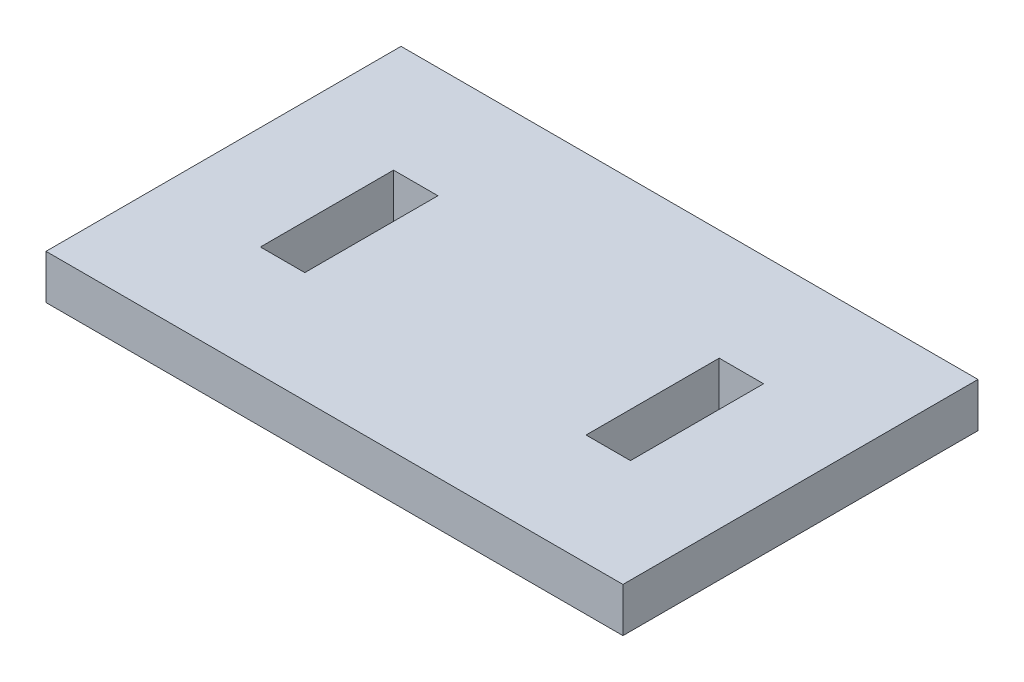
ISO-10303-21;
HEADER;
FILE_DESCRIPTION(('STEP AP214'),'2;1');
FILE_NAME('part.step','',(''),(''),'','','');
FILE_SCHEMA(('AUTOMOTIVE_DESIGN { 1 0 10303 214 1 1 1 1 }'));
ENDSEC;
DATA;
#1=APPLICATION_CONTEXT('core data for automotive mechanical design processes');
#2=APPLICATION_PROTOCOL_DEFINITION('international standard','automotive_design',2000,#1);
#3=PRODUCT_CONTEXT('',#1,'mechanical');
#4=PRODUCT('Part','Part','',(#3));
#5=PRODUCT_RELATED_PRODUCT_CATEGORY('part','',(#4));
#6=PRODUCT_DEFINITION_FORMATION('','',#4);
#7=PRODUCT_DEFINITION_CONTEXT('part definition',#1,'design');
#8=PRODUCT_DEFINITION('design','',#6,#7);
#9=PRODUCT_DEFINITION_SHAPE('','',#8);
#10=(LENGTH_UNIT() NAMED_UNIT(*) SI_UNIT(.MILLI.,.METRE.));
#11=(NAMED_UNIT(*) PLANE_ANGLE_UNIT() SI_UNIT($,.RADIAN.));
#12=(NAMED_UNIT(*) SI_UNIT($,.STERADIAN.) SOLID_ANGLE_UNIT());
#13=UNCERTAINTY_MEASURE_WITH_UNIT(LENGTH_MEASURE(1.E-05),#10,'distance_accuracy_value','');
#14=(GEOMETRIC_REPRESENTATION_CONTEXT(3) GLOBAL_UNCERTAINTY_ASSIGNED_CONTEXT((#13)) GLOBAL_UNIT_ASSIGNED_CONTEXT((#10,
#11,#12)) REPRESENTATION_CONTEXT('',''));
#15=CARTESIAN_POINT('',(0.,0.,0.));
#16=DIRECTION('',(0.,0.,1.));
#17=DIRECTION('',(1.,0.,0.));
#18=AXIS2_PLACEMENT_3D('',#15,#16,#17);
#19=CARTESIAN_POINT('',(0.,3.175,0.));
#20=DIRECTION('',(0.,-1.,0.));
#21=DIRECTION('',(0.,0.,-1.));
#22=AXIS2_PLACEMENT_3D('',#19,#20,#21);
#23=PLANE('',#22);
#24=DIRECTION('',(0.,0.,1.));
#25=VECTOR('',#24,1.);
#26=CARTESIAN_POINT('',(7.40130587110055,3.175,-17.4625));
#27=LINE('',#26,#25);
#28=CARTESIAN_POINT('',(7.40130587110055,3.175,-17.4625));
#29=VERTEX_POINT('',#28);
#30=CARTESIAN_POINT('',(7.40130587110056,3.175,-7.9375));
#31=VERTEX_POINT('',#30);
#32=EDGE_CURVE('E158',#29,#31,#27,.T.);
#33=ORIENTED_EDGE('',*,*,#32,.F.);
#34=DIRECTION('',(-1.,0.,0.));
#35=VECTOR('',#34,1.);
#36=CARTESIAN_POINT('',(7.40130587110055,3.175,-17.4625));
#37=LINE('',#36,#35);
#38=CARTESIAN_POINT('',(10.5763058711006,3.175,-17.4625));
#39=VERTEX_POINT('',#38);
#40=EDGE_CURVE('E166',#39,#29,#37,.T.);
#41=ORIENTED_EDGE('',*,*,#40,.F.);
#42=DIRECTION('',(0.,0.,-1.));
#43=VECTOR('',#42,1.);
#44=CARTESIAN_POINT('',(10.5763058711006,3.175,-17.4625));
#45=LINE('',#44,#43);
#46=CARTESIAN_POINT('',(10.5763058711006,3.175,-7.9375));
#47=VERTEX_POINT('',#46);
#48=EDGE_CURVE('E163',#47,#39,#45,.T.);
#49=ORIENTED_EDGE('',*,*,#48,.F.);
#50=DIRECTION('',(1.,0.,0.));
#51=VECTOR('',#50,1.);
#52=CARTESIAN_POINT('',(7.40130587110056,3.175,-7.9375));
#53=LINE('',#52,#51);
#54=EDGE_CURVE('E160',#31,#47,#53,.T.);
#55=ORIENTED_EDGE('',*,*,#54,.F.);
#56=EDGE_LOOP('',(#33,#41,#49,#55));
#57=FACE_BOUND('',#56,.T.);
#58=DIRECTION('',(0.,0.,1.));
#59=VECTOR('',#58,1.);
#60=CARTESIAN_POINT('',(0.,3.175,0.));
#61=LINE('',#60,#59);
#62=CARTESIAN_POINT('',(0.,3.175,-25.4));
#63=VERTEX_POINT('',#62);
#64=CARTESIAN_POINT('',(0.,3.175,0.));
#65=VERTEX_POINT('',#64);
#66=EDGE_CURVE('E189',#63,#65,#61,.T.);
#67=ORIENTED_EDGE('',*,*,#66,.T.);
#68=DIRECTION('',(1.,0.,0.));
#69=VECTOR('',#68,1.);
#70=CARTESIAN_POINT('',(0.,3.175,0.));
#71=LINE('',#70,#69);
#72=CARTESIAN_POINT('',(41.275,3.175,0.));
#73=VERTEX_POINT('',#72);
#74=EDGE_CURVE('E192',#65,#73,#71,.T.);
#75=ORIENTED_EDGE('',*,*,#74,.T.);
#76=DIRECTION('',(0.,0.,-1.));
#77=VECTOR('',#76,1.);
#78=CARTESIAN_POINT('',(41.275,3.175,0.));
#79=LINE('',#78,#77);
#80=CARTESIAN_POINT('',(41.275,3.175,-25.4));
#81=VERTEX_POINT('',#80);
#82=EDGE_CURVE('E195',#73,#81,#79,.T.);
#83=ORIENTED_EDGE('',*,*,#82,.T.);
#84=DIRECTION('',(-1.,0.,0.));
#85=VECTOR('',#84,1.);
#86=CARTESIAN_POINT('',(0.,3.175,-25.4));
#87=LINE('',#86,#85);
#88=EDGE_CURVE('E197',#81,#63,#87,.T.);
#89=ORIENTED_EDGE('',*,*,#88,.T.);
#90=EDGE_LOOP('',(#67,#75,#83,#89));
#91=FACE_BOUND('',#90,.T.);
#92=DIRECTION('',(0.,0.,-1.));
#93=VECTOR('',#92,1.);
#94=CARTESIAN_POINT('',(33.8736941288994,3.175,-17.4625));
#95=LINE('',#94,#93);
#96=CARTESIAN_POINT('',(33.8736941288994,3.175,-7.9375));
#97=VERTEX_POINT('',#96);
#98=CARTESIAN_POINT('',(33.8736941288994,3.175,-17.4625));
#99=VERTEX_POINT('',#98);
#100=EDGE_CURVE('E122',#97,#99,#95,.T.);
#101=ORIENTED_EDGE('',*,*,#100,.F.);
#102=DIRECTION('',(1.,0.,0.));
#103=VECTOR('',#102,1.);
#104=CARTESIAN_POINT('',(33.8736941288994,3.175,-7.9375));
#105=LINE('',#104,#103);
#106=CARTESIAN_POINT('',(30.6986941288994,3.175,-7.9375));
#107=VERTEX_POINT('',#106);
#108=EDGE_CURVE('E144',#107,#97,#105,.T.);
#109=ORIENTED_EDGE('',*,*,#108,.F.);
#110=DIRECTION('',(0.,0.,1.));
#111=VECTOR('',#110,1.);
#112=CARTESIAN_POINT('',(30.6986941288994,3.175,-17.4625));
#113=LINE('',#112,#111);
#114=CARTESIAN_POINT('',(30.6986941288994,3.175,-17.4625));
#115=VERTEX_POINT('',#114);
#116=EDGE_CURVE('E142',#115,#107,#113,.T.);
#117=ORIENTED_EDGE('',*,*,#116,.F.);
#118=DIRECTION('',(-1.,0.,0.));
#119=VECTOR('',#118,1.);
#120=CARTESIAN_POINT('',(33.8736941288994,3.175,-17.4625));
#121=LINE('',#120,#119);
#122=EDGE_CURVE('E130',#99,#115,#121,.T.);
#123=ORIENTED_EDGE('',*,*,#122,.F.);
#124=EDGE_LOOP('',(#101,#109,#117,#123));
#125=FACE_BOUND('',#124,.T.);
#126=ADVANCED_FACE('F33',(#57,#91,#125),#23,.F.);
#127=CARTESIAN_POINT('',(0.,0.,0.));
#128=DIRECTION('',(0.,-1.,0.));
#129=DIRECTION('',(0.,0.,-1.));
#130=AXIS2_PLACEMENT_3D('',#127,#128,#129);
#131=PLANE('',#130);
#132=DIRECTION('',(0.,0.,1.));
#133=VECTOR('',#132,1.);
#134=CARTESIAN_POINT('',(0.,0.,0.));
#135=LINE('',#134,#133);
#136=CARTESIAN_POINT('',(0.,0.,-25.4));
#137=VERTEX_POINT('',#136);
#138=CARTESIAN_POINT('',(0.,0.,0.));
#139=VERTEX_POINT('',#138);
#140=EDGE_CURVE('E188',#137,#139,#135,.T.);
#141=ORIENTED_EDGE('',*,*,#140,.F.);
#142=DIRECTION('',(-1.,0.,0.));
#143=VECTOR('',#142,1.);
#144=CARTESIAN_POINT('',(0.,0.,-25.4));
#145=LINE('',#144,#143);
#146=CARTESIAN_POINT('',(41.275,0.,-25.4));
#147=VERTEX_POINT('',#146);
#148=EDGE_CURVE('E193',#147,#137,#145,.T.);
#149=ORIENTED_EDGE('',*,*,#148,.F.);
#150=DIRECTION('',(0.,0.,-1.));
#151=VECTOR('',#150,1.);
#152=CARTESIAN_POINT('',(41.275,0.,0.));
#153=LINE('',#152,#151);
#154=CARTESIAN_POINT('',(41.275,0.,0.));
#155=VERTEX_POINT('',#154);
#156=EDGE_CURVE('E204',#155,#147,#153,.T.);
#157=ORIENTED_EDGE('',*,*,#156,.F.);
#158=DIRECTION('',(1.,0.,0.));
#159=VECTOR('',#158,1.);
#160=CARTESIAN_POINT('',(0.,0.,0.));
#161=LINE('',#160,#159);
#162=EDGE_CURVE('E202',#139,#155,#161,.T.);
#163=ORIENTED_EDGE('',*,*,#162,.F.);
#164=EDGE_LOOP('',(#141,#149,#157,#163));
#165=FACE_BOUND('',#164,.T.);
#166=DIRECTION('',(-1.,0.,0.));
#167=VECTOR('',#166,1.);
#168=CARTESIAN_POINT('',(7.40130587110055,0.,-17.4625));
#169=LINE('',#168,#167);
#170=CARTESIAN_POINT('',(10.5763058711006,0.,-17.4625));
#171=VERTEX_POINT('',#170);
#172=CARTESIAN_POINT('',(7.40130587110055,0.,-17.4625));
#173=VERTEX_POINT('',#172);
#174=EDGE_CURVE('E161',#171,#173,#169,.T.);
#175=ORIENTED_EDGE('',*,*,#174,.T.);
#176=DIRECTION('',(0.,0.,1.));
#177=VECTOR('',#176,1.);
#178=CARTESIAN_POINT('',(7.40130587110055,0.,-17.4625));
#179=LINE('',#178,#177);
#180=CARTESIAN_POINT('',(7.40130587110056,0.,-7.9375));
#181=VERTEX_POINT('',#180);
#182=EDGE_CURVE('E138',#173,#181,#179,.T.);
#183=ORIENTED_EDGE('',*,*,#182,.T.);
#184=DIRECTION('',(1.,0.,0.));
#185=VECTOR('',#184,1.);
#186=CARTESIAN_POINT('',(7.40130587110056,0.,-7.9375));
#187=LINE('',#186,#185);
#188=CARTESIAN_POINT('',(10.5763058711006,0.,-7.9375));
#189=VERTEX_POINT('',#188);
#190=EDGE_CURVE('E171',#181,#189,#187,.T.);
#191=ORIENTED_EDGE('',*,*,#190,.T.);
#192=DIRECTION('',(0.,0.,-1.));
#193=VECTOR('',#192,1.);
#194=CARTESIAN_POINT('',(10.5763058711006,0.,-17.4625));
#195=LINE('',#194,#193);
#196=EDGE_CURVE('E174',#189,#171,#195,.T.);
#197=ORIENTED_EDGE('',*,*,#196,.T.);
#198=EDGE_LOOP('',(#175,#183,#191,#197));
#199=FACE_BOUND('',#198,.T.);
#200=DIRECTION('',(1.,0.,0.));
#201=VECTOR('',#200,1.);
#202=CARTESIAN_POINT('',(33.8736941288994,0.,-7.9375));
#203=LINE('',#202,#201);
#204=CARTESIAN_POINT('',(30.6986941288994,0.,-7.9375));
#205=VERTEX_POINT('',#204);
#206=CARTESIAN_POINT('',(33.8736941288994,0.,-7.9375));
#207=VERTEX_POINT('',#206);
#208=EDGE_CURVE('E131',#205,#207,#203,.T.);
#209=ORIENTED_EDGE('',*,*,#208,.T.);
#210=DIRECTION('',(0.,0.,-1.));
#211=VECTOR('',#210,1.);
#212=CARTESIAN_POINT('',(33.8736941288994,0.,-17.4625));
#213=LINE('',#212,#211);
#214=CARTESIAN_POINT('',(33.8736941288994,0.,-17.4625));
#215=VERTEX_POINT('',#214);
#216=EDGE_CURVE('E56',#207,#215,#213,.T.);
#217=ORIENTED_EDGE('',*,*,#216,.T.);
#218=DIRECTION('',(-1.,0.,0.));
#219=VECTOR('',#218,1.);
#220=CARTESIAN_POINT('',(33.8736941288994,0.,-17.4625));
#221=LINE('',#220,#219);
#222=CARTESIAN_POINT('',(30.6986941288994,0.,-17.4625));
#223=VERTEX_POINT('',#222);
#224=EDGE_CURVE('E137',#215,#223,#221,.T.);
#225=ORIENTED_EDGE('',*,*,#224,.T.);
#226=DIRECTION('',(0.,0.,1.));
#227=VECTOR('',#226,1.);
#228=CARTESIAN_POINT('',(30.6986941288994,0.,-17.4625));
#229=LINE('',#228,#227);
#230=EDGE_CURVE('E150',#223,#205,#229,.T.);
#231=ORIENTED_EDGE('',*,*,#230,.T.);
#232=EDGE_LOOP('',(#209,#217,#225,#231));
#233=FACE_BOUND('',#232,.T.);
#234=ADVANCED_FACE('F222',(#165,#199,#233),#131,.T.);
#235=CARTESIAN_POINT('',(0.,3.175,0.));
#236=DIRECTION('',(1.,0.,0.));
#237=DIRECTION('',(0.,0.,-1.));
#238=AXIS2_PLACEMENT_3D('',#235,#236,#237);
#239=PLANE('',#238);
#240=ORIENTED_EDGE('',*,*,#140,.T.);
#241=DIRECTION('',(0.,-1.,0.));
#242=VECTOR('',#241,1.);
#243=CARTESIAN_POINT('',(0.,3.175,0.));
#244=LINE('',#243,#242);
#245=EDGE_CURVE('E11',#65,#139,#244,.T.);
#246=ORIENTED_EDGE('',*,*,#245,.F.);
#247=ORIENTED_EDGE('',*,*,#66,.F.);
#248=DIRECTION('',(0.,-1.,0.));
#249=VECTOR('',#248,1.);
#250=CARTESIAN_POINT('',(0.,3.175,-25.4));
#251=LINE('',#250,#249);
#252=EDGE_CURVE('E199',#63,#137,#251,.T.);
#253=ORIENTED_EDGE('',*,*,#252,.T.);
#254=EDGE_LOOP('',(#240,#246,#247,#253));
#255=FACE_BOUND('',#254,.T.);
#256=ADVANCED_FACE('F35',(#255),#239,.F.);
#257=CARTESIAN_POINT('',(0.,3.175,0.));
#258=DIRECTION('',(0.,0.,-1.));
#259=DIRECTION('',(-1.,0.,0.));
#260=AXIS2_PLACEMENT_3D('',#257,#258,#259);
#261=PLANE('',#260);
#262=ORIENTED_EDGE('',*,*,#162,.T.);
#263=DIRECTION('',(0.,-1.,0.));
#264=VECTOR('',#263,1.);
#265=CARTESIAN_POINT('',(41.275,3.175,0.));
#266=LINE('',#265,#264);
#267=EDGE_CURVE('E41',#73,#155,#266,.T.);
#268=ORIENTED_EDGE('',*,*,#267,.F.);
#269=ORIENTED_EDGE('',*,*,#74,.F.);
#270=ORIENTED_EDGE('',*,*,#245,.T.);
#271=EDGE_LOOP('',(#262,#268,#269,#270));
#272=FACE_BOUND('',#271,.T.);
#273=ADVANCED_FACE('F232',(#272),#261,.F.);
#274=CARTESIAN_POINT('',(41.275,3.175,0.));
#275=DIRECTION('',(-1.,0.,0.));
#276=DIRECTION('',(0.,0.,1.));
#277=AXIS2_PLACEMENT_3D('',#274,#275,#276);
#278=PLANE('',#277);
#279=ORIENTED_EDGE('',*,*,#156,.T.);
#280=DIRECTION('',(0.,-1.,0.));
#281=VECTOR('',#280,1.);
#282=CARTESIAN_POINT('',(41.275,3.175,-25.4));
#283=LINE('',#282,#281);
#284=EDGE_CURVE('E209',#81,#147,#283,.T.);
#285=ORIENTED_EDGE('',*,*,#284,.F.);
#286=ORIENTED_EDGE('',*,*,#82,.F.);
#287=ORIENTED_EDGE('',*,*,#267,.T.);
#288=EDGE_LOOP('',(#279,#285,#286,#287));
#289=FACE_BOUND('',#288,.T.);
#290=ADVANCED_FACE('F216',(#289),#278,.F.);
#291=CARTESIAN_POINT('',(0.,3.175,-25.4));
#292=DIRECTION('',(0.,0.,1.));
#293=DIRECTION('',(1.,0.,0.));
#294=AXIS2_PLACEMENT_3D('',#291,#292,#293);
#295=PLANE('',#294);
#296=ORIENTED_EDGE('',*,*,#148,.T.);
#297=ORIENTED_EDGE('',*,*,#252,.F.);
#298=ORIENTED_EDGE('',*,*,#88,.F.);
#299=ORIENTED_EDGE('',*,*,#284,.T.);
#300=EDGE_LOOP('',(#296,#297,#298,#299));
#301=FACE_BOUND('',#300,.T.);
#302=ADVANCED_FACE('F226',(#301),#295,.F.);
#303=CARTESIAN_POINT('',(7.40130587110055,3.175,-17.4625));
#304=DIRECTION('',(1.,0.,0.));
#305=DIRECTION('',(0.,0.,-1.));
#306=AXIS2_PLACEMENT_3D('',#303,#304,#305);
#307=PLANE('',#306);
#308=ORIENTED_EDGE('',*,*,#182,.F.);
#309=DIRECTION('',(0.,-1.,0.));
#310=VECTOR('',#309,1.);
#311=CARTESIAN_POINT('',(7.40130587110055,3.175,-17.4625));
#312=LINE('',#311,#310);
#313=EDGE_CURVE('E168',#29,#173,#312,.T.);
#314=ORIENTED_EDGE('',*,*,#313,.F.);
#315=ORIENTED_EDGE('',*,*,#32,.T.);
#316=DIRECTION('',(0.,-1.,0.));
#317=VECTOR('',#316,1.);
#318=CARTESIAN_POINT('',(7.40130587110056,3.175,-7.9375));
#319=LINE('',#318,#317);
#320=EDGE_CURVE('E185',#31,#181,#319,.T.);
#321=ORIENTED_EDGE('',*,*,#320,.T.);
#322=EDGE_LOOP('',(#308,#314,#315,#321));
#323=FACE_BOUND('',#322,.T.);
#324=ADVANCED_FACE('F248',(#323),#307,.T.);
#325=CARTESIAN_POINT('',(7.40130587110056,3.175,-7.9375));
#326=DIRECTION('',(0.,0.,-1.));
#327=DIRECTION('',(-1.,0.,0.));
#328=AXIS2_PLACEMENT_3D('',#325,#326,#327);
#329=PLANE('',#328);
#330=ORIENTED_EDGE('',*,*,#190,.F.);
#331=ORIENTED_EDGE('',*,*,#320,.F.);
#332=ORIENTED_EDGE('',*,*,#54,.T.);
#333=DIRECTION('',(0.,-1.,0.));
#334=VECTOR('',#333,1.);
#335=CARTESIAN_POINT('',(10.5763058711006,3.175,-7.9375));
#336=LINE('',#335,#334);
#337=EDGE_CURVE('E183',#47,#189,#336,.T.);
#338=ORIENTED_EDGE('',*,*,#337,.T.);
#339=EDGE_LOOP('',(#330,#331,#332,#338));
#340=FACE_BOUND('',#339,.T.);
#341=ADVANCED_FACE('F255',(#340),#329,.T.);
#342=CARTESIAN_POINT('',(10.5763058711006,3.175,-17.4625));
#343=DIRECTION('',(-1.,0.,0.));
#344=DIRECTION('',(0.,0.,1.));
#345=AXIS2_PLACEMENT_3D('',#342,#343,#344);
#346=PLANE('',#345);
#347=ORIENTED_EDGE('',*,*,#196,.F.);
#348=ORIENTED_EDGE('',*,*,#337,.F.);
#349=ORIENTED_EDGE('',*,*,#48,.T.);
#350=DIRECTION('',(0.,-1.,0.));
#351=VECTOR('',#350,1.);
#352=CARTESIAN_POINT('',(10.5763058711006,3.175,-17.4625));
#353=LINE('',#352,#351);
#354=EDGE_CURVE('E181',#39,#171,#353,.T.);
#355=ORIENTED_EDGE('',*,*,#354,.T.);
#356=EDGE_LOOP('',(#347,#348,#349,#355));
#357=FACE_BOUND('',#356,.T.);
#358=ADVANCED_FACE('F260',(#357),#346,.T.);
#359=CARTESIAN_POINT('',(7.40130587110055,3.175,-17.4625));
#360=DIRECTION('',(0.,0.,1.));
#361=DIRECTION('',(1.,0.,0.));
#362=AXIS2_PLACEMENT_3D('',#359,#360,#361);
#363=PLANE('',#362);
#364=ORIENTED_EDGE('',*,*,#174,.F.);
#365=ORIENTED_EDGE('',*,*,#354,.F.);
#366=ORIENTED_EDGE('',*,*,#40,.T.);
#367=ORIENTED_EDGE('',*,*,#313,.T.);
#368=EDGE_LOOP('',(#364,#365,#366,#367));
#369=FACE_BOUND('',#368,.T.);
#370=ADVANCED_FACE('F266',(#369),#363,.T.);
#371=CARTESIAN_POINT('',(33.8736941288994,3.175,-17.4625));
#372=DIRECTION('',(-1.,0.,0.));
#373=DIRECTION('',(0.,0.,1.));
#374=AXIS2_PLACEMENT_3D('',#371,#372,#373);
#375=PLANE('',#374);
#376=ORIENTED_EDGE('',*,*,#216,.F.);
#377=DIRECTION('',(0.,-1.,0.));
#378=VECTOR('',#377,1.);
#379=CARTESIAN_POINT('',(33.8736941288994,3.175,-7.9375));
#380=LINE('',#379,#378);
#381=EDGE_CURVE('E126',#97,#207,#380,.T.);
#382=ORIENTED_EDGE('',*,*,#381,.F.);
#383=ORIENTED_EDGE('',*,*,#100,.T.);
#384=DIRECTION('',(0.,-1.,0.));
#385=VECTOR('',#384,1.);
#386=CARTESIAN_POINT('',(33.8736941288994,3.175,-17.4625));
#387=LINE('',#386,#385);
#388=EDGE_CURVE('E125',#99,#215,#387,.T.);
#389=ORIENTED_EDGE('',*,*,#388,.T.);
#390=EDGE_LOOP('',(#376,#382,#383,#389));
#391=FACE_BOUND('',#390,.T.);
#392=ADVANCED_FACE('F124',(#391),#375,.T.);
#393=CARTESIAN_POINT('',(33.8736941288994,3.175,-17.4625));
#394=DIRECTION('',(0.,0.,1.));
#395=DIRECTION('',(1.,0.,0.));
#396=AXIS2_PLACEMENT_3D('',#393,#394,#395);
#397=PLANE('',#396);
#398=ORIENTED_EDGE('',*,*,#224,.F.);
#399=ORIENTED_EDGE('',*,*,#388,.F.);
#400=ORIENTED_EDGE('',*,*,#122,.T.);
#401=DIRECTION('',(0.,-1.,0.));
#402=VECTOR('',#401,1.);
#403=CARTESIAN_POINT('',(30.6986941288994,3.175,-17.4625));
#404=LINE('',#403,#402);
#405=EDGE_CURVE('E139',#115,#223,#404,.T.);
#406=ORIENTED_EDGE('',*,*,#405,.T.);
#407=EDGE_LOOP('',(#398,#399,#400,#406));
#408=FACE_BOUND('',#407,.T.);
#409=ADVANCED_FACE('F134',(#408),#397,.T.);
#410=CARTESIAN_POINT('',(30.6986941288994,3.175,-17.4625));
#411=DIRECTION('',(1.,0.,0.));
#412=DIRECTION('',(0.,0.,-1.));
#413=AXIS2_PLACEMENT_3D('',#410,#411,#412);
#414=PLANE('',#413);
#415=ORIENTED_EDGE('',*,*,#230,.F.);
#416=ORIENTED_EDGE('',*,*,#405,.F.);
#417=ORIENTED_EDGE('',*,*,#116,.T.);
#418=DIRECTION('',(0.,-1.,0.));
#419=VECTOR('',#418,1.);
#420=CARTESIAN_POINT('',(30.6986941288994,3.175,-7.9375));
#421=LINE('',#420,#419);
#422=EDGE_CURVE('E48',#107,#205,#421,.T.);
#423=ORIENTED_EDGE('',*,*,#422,.T.);
#424=EDGE_LOOP('',(#415,#416,#417,#423));
#425=FACE_BOUND('',#424,.T.);
#426=ADVANCED_FACE('F285',(#425),#414,.T.);
#427=CARTESIAN_POINT('',(33.8736941288994,3.175,-7.9375));
#428=DIRECTION('',(0.,0.,-1.));
#429=DIRECTION('',(-1.,0.,0.));
#430=AXIS2_PLACEMENT_3D('',#427,#428,#429);
#431=PLANE('',#430);
#432=ORIENTED_EDGE('',*,*,#208,.F.);
#433=ORIENTED_EDGE('',*,*,#422,.F.);
#434=ORIENTED_EDGE('',*,*,#108,.T.);
#435=ORIENTED_EDGE('',*,*,#381,.T.);
#436=EDGE_LOOP('',(#432,#433,#434,#435));
#437=FACE_BOUND('',#436,.T.);
#438=ADVANCED_FACE('F288',(#437),#431,.T.);
#439=CLOSED_SHELL('',(#126,#234,#256,#273,#290,#302,#324,#341,#358,#370,#392,#409,#426,#438));
#440=MANIFOLD_SOLID_BREP('B2',#439);
#441=ADVANCED_BREP_SHAPE_REPRESENTATION('',(#18,#440),#14);
#442=SHAPE_DEFINITION_REPRESENTATION(#9,#441);
ENDSEC;
END-ISO-10303-21;
